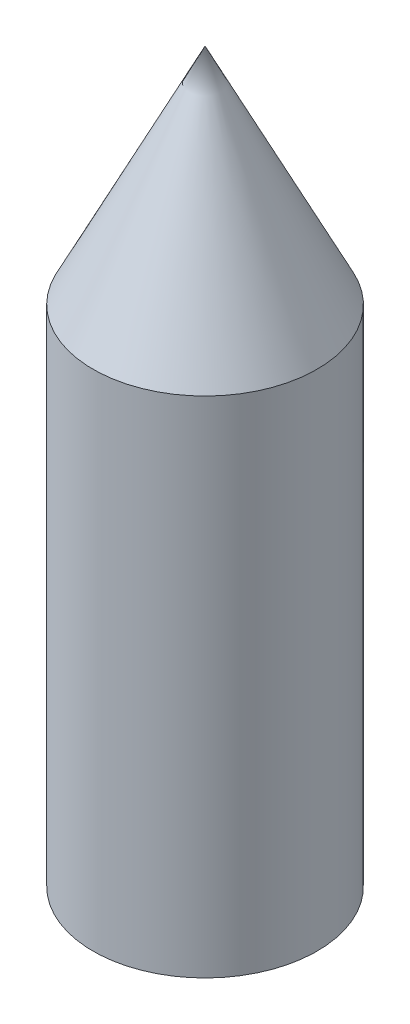
ISO-10303-21;
HEADER;
FILE_DESCRIPTION(('STEP AP214'),'2;1');
FILE_NAME('part.step','',(''),(''),'','','');
FILE_SCHEMA(('AUTOMOTIVE_DESIGN { 1 0 10303 214 1 1 1 1 }'));
ENDSEC;
DATA;
#1=APPLICATION_CONTEXT('core data for automotive mechanical design processes');
#2=APPLICATION_PROTOCOL_DEFINITION('international standard','automotive_design',2000,#1);
#3=PRODUCT_CONTEXT('',#1,'mechanical');
#4=PRODUCT('Part','Part','',(#3));
#5=PRODUCT_RELATED_PRODUCT_CATEGORY('part','',(#4));
#6=PRODUCT_DEFINITION_FORMATION('','',#4);
#7=PRODUCT_DEFINITION_CONTEXT('part definition',#1,'design');
#8=PRODUCT_DEFINITION('design','',#6,#7);
#9=PRODUCT_DEFINITION_SHAPE('','',#8);
#10=(LENGTH_UNIT() NAMED_UNIT(*) SI_UNIT(.MILLI.,.METRE.));
#11=(NAMED_UNIT(*) PLANE_ANGLE_UNIT() SI_UNIT($,.RADIAN.));
#12=(NAMED_UNIT(*) SI_UNIT($,.STERADIAN.) SOLID_ANGLE_UNIT());
#13=UNCERTAINTY_MEASURE_WITH_UNIT(LENGTH_MEASURE(1.E-05),#10,'distance_accuracy_value','');
#14=(GEOMETRIC_REPRESENTATION_CONTEXT(3) GLOBAL_UNCERTAINTY_ASSIGNED_CONTEXT((#13)) GLOBAL_UNIT_ASSIGNED_CONTEXT((#10,
#11,#12)) REPRESENTATION_CONTEXT('',''));
#15=CARTESIAN_POINT('',(0.,0.,0.));
#16=DIRECTION('',(0.,0.,1.));
#17=DIRECTION('',(1.,0.,0.));
#18=AXIS2_PLACEMENT_3D('',#15,#16,#17);
#19=CARTESIAN_POINT('',(0.,0.,0.));
#20=DIRECTION('',(0.,1.,0.));
#21=DIRECTION('',(0.,0.,1.));
#22=AXIS2_PLACEMENT_3D('',#19,#20,#21);
#23=PLANE('',#22);
#24=CARTESIAN_POINT('',(0.,0.,0.));
#25=DIRECTION('',(0.,-1.,0.));
#26=DIRECTION('',(0.,0.,-1.));
#27=AXIS2_PLACEMENT_3D('',#24,#25,#26);
#28=CIRCLE('',#27,20.);
#29=CARTESIAN_POINT('',(0.,0.,-20.));
#30=VERTEX_POINT('',#29);
#31=EDGE_CURVE('E11',#30,#30,#28,.T.);
#32=ORIENTED_EDGE('',*,*,#31,.T.);
#33=EDGE_LOOP('',(#32));
#34=FACE_BOUND('',#33,.T.);
#35=ADVANCED_FACE('F41',(#34),#23,.F.);
#36=CARTESIAN_POINT('',(0.,0.,0.));
#37=DIRECTION('',(0.,-1.,0.));
#38=DIRECTION('',(0.,0.,-1.));
#39=AXIS2_PLACEMENT_3D('',#36,#37,#38);
#40=CYLINDRICAL_SURFACE('',#39,20.);
#41=ORIENTED_EDGE('',*,*,#31,.F.);
#42=EDGE_LOOP('',(#41));
#43=FACE_BOUND('',#42,.T.);
#44=CARTESIAN_POINT('',(0.,90.,0.));
#45=DIRECTION('',(0.,-1.,0.));
#46=DIRECTION('',(0.,0.,-1.));
#47=AXIS2_PLACEMENT_3D('',#44,#45,#46);
#48=CIRCLE('',#47,20.);
#49=CARTESIAN_POINT('',(0.,90.,-20.));
#50=VERTEX_POINT('',#49);
#51=EDGE_CURVE('E48',#50,#50,#48,.T.);
#52=ORIENTED_EDGE('',*,*,#51,.T.);
#53=EDGE_LOOP('',(#52));
#54=FACE_BOUND('',#53,.T.);
#55=ADVANCED_FACE('F53',(#43,#54),#40,.T.);
#56=CARTESIAN_POINT('',(0.,130.,0.));
#57=DIRECTION('',(0.,-1.,0.));
#58=DIRECTION('',(0.,0.,-1.));
#59=AXIS2_PLACEMENT_3D('',#56,#57,#58);
#60=CONICAL_SURFACE('',#59,0.,0.463647609000806);
#61=ORIENTED_EDGE('',*,*,#51,.F.);
#62=EDGE_LOOP('',(#61));
#63=FACE_BOUND('',#62,.T.);
#64=CARTESIAN_POINT('',(0.,130.,0.));
#65=VERTEX_POINT('',#64);
#66=VERTEX_LOOP('',#65);
#67=FACE_BOUND('',#66,.T.);
#68=ADVANCED_FACE('F51',(#63,#67),#60,.T.);
#69=CLOSED_SHELL('',(#35,#55,#68));
#70=MANIFOLD_SOLID_BREP('B2',#69);
#71=ADVANCED_BREP_SHAPE_REPRESENTATION('',(#18,#70),#14);
#72=SHAPE_DEFINITION_REPRESENTATION(#9,#71);
ENDSEC;
END-ISO-10303-21;
